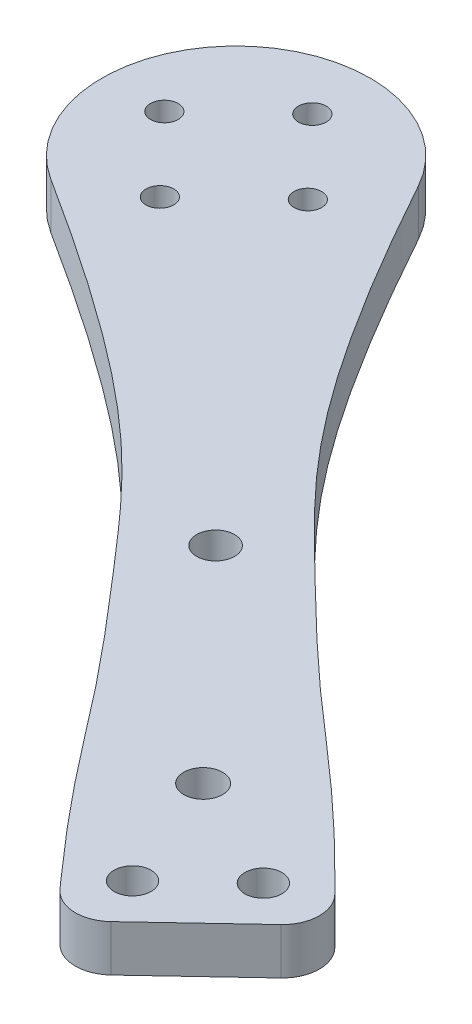
ISO-10303-21;
HEADER;
FILE_DESCRIPTION(('STEP AP214'),'2;1');
FILE_NAME('part.step','',(''),(''),'','','');
FILE_SCHEMA(('AUTOMOTIVE_DESIGN { 1 0 10303 214 1 1 1 1 }'));
ENDSEC;
DATA;
#1=APPLICATION_CONTEXT('core data for automotive mechanical design processes');
#2=APPLICATION_PROTOCOL_DEFINITION('international standard','automotive_design',2000,#1);
#3=PRODUCT_CONTEXT('',#1,'mechanical');
#4=PRODUCT('Part','Part','',(#3));
#5=PRODUCT_RELATED_PRODUCT_CATEGORY('part','',(#4));
#6=PRODUCT_DEFINITION_FORMATION('','',#4);
#7=PRODUCT_DEFINITION_CONTEXT('part definition',#1,'design');
#8=PRODUCT_DEFINITION('design','',#6,#7);
#9=PRODUCT_DEFINITION_SHAPE('','',#8);
#10=(LENGTH_UNIT() NAMED_UNIT(*) SI_UNIT(.MILLI.,.METRE.));
#11=(NAMED_UNIT(*) PLANE_ANGLE_UNIT() SI_UNIT($,.RADIAN.));
#12=(NAMED_UNIT(*) SI_UNIT($,.STERADIAN.) SOLID_ANGLE_UNIT());
#13=UNCERTAINTY_MEASURE_WITH_UNIT(LENGTH_MEASURE(1.E-05),#10,'distance_accuracy_value','');
#14=(GEOMETRIC_REPRESENTATION_CONTEXT(3) GLOBAL_UNCERTAINTY_ASSIGNED_CONTEXT((#13)) GLOBAL_UNIT_ASSIGNED_CONTEXT((#10,
#11,#12)) REPRESENTATION_CONTEXT('',''));
#15=CARTESIAN_POINT('',(0.,0.,0.));
#16=DIRECTION('',(0.,0.,1.));
#17=DIRECTION('',(1.,0.,0.));
#18=AXIS2_PLACEMENT_3D('',#15,#16,#17);
#19=CARTESIAN_POINT('',(-44.0947732228864,5.,-31.5303860412853));
#20=CARTESIAN_POINT('',(-52.4445145966826,5.,-40.8898758768842));
#21=CARTESIAN_POINT('',(-59.2108899865711,5.,-50.6068180202608));
#22=CARTESIAN_POINT('',(-76.0376842546752,5.,-70.1194758281589));
#23=CARTESIAN_POINT('',(-86.2011588527029,5.,-81.5356612766143));
#24=CARTESIAN_POINT('',(-110.568455215221,5.,-96.9836043210985));
#25=B_SPLINE_CURVE_WITH_KNOTS('',3,(#19,#20,#21,#22,#23,#24),.UNSPECIFIED.,.F.,.F.,(4,1,1,4),
(0.,0.287490219149772,0.546399650186931,1.),.UNSPECIFIED.);
#26=DIRECTION('',(0.,-1.,0.));
#27=VECTOR('',#26,1.);
#28=SURFACE_OF_LINEAR_EXTRUSION('',#25,#27);
#29=CARTESIAN_POINT('',(-44.0947732228864,0.,-31.5303860412853));
#30=CARTESIAN_POINT('',(-52.4445145966826,0.,-40.8898758768842));
#31=CARTESIAN_POINT('',(-59.2108899865711,0.,-50.6068180202608));
#32=CARTESIAN_POINT('',(-76.0376842546752,0.,-70.1194758281589));
#33=CARTESIAN_POINT('',(-86.2011588527029,0.,-81.5356612766143));
#34=CARTESIAN_POINT('',(-110.568455215221,0.,-96.9836043210985));
#35=B_SPLINE_CURVE_WITH_KNOTS('',3,(#29,#30,#31,#32,#33,#34),.UNSPECIFIED.,.F.,.F.,(4,1,1,4),
(0.,0.287490219149772,0.546399650186931,1.),.UNSPECIFIED.);
#36=CARTESIAN_POINT('',(-44.0947732228865,0.,-31.5303860412854));
#37=VERTEX_POINT('',#36);
#38=CARTESIAN_POINT('',(-110.568455215221,0.,-96.9836043210992));
#39=VERTEX_POINT('',#38);
#40=EDGE_CURVE('E116',#37,#39,#35,.T.);
#41=ORIENTED_EDGE('',*,*,#40,.F.);
#42=DIRECTION('',(0.,-1.,0.));
#43=VECTOR('',#42,1.);
#44=CARTESIAN_POINT('',(-44.0947732228865,5.,-31.5303860412854));
#45=LINE('',#44,#43);
#46=CARTESIAN_POINT('',(-44.0947732228865,5.,-31.5303860412854));
#47=VERTEX_POINT('',#46);
#48=EDGE_CURVE('E106',#47,#37,#45,.T.);
#49=ORIENTED_EDGE('',*,*,#48,.F.);
#50=CARTESIAN_POINT('',(-110.568455215221,5.,-96.9836043210992));
#51=VERTEX_POINT('',#50);
#52=EDGE_CURVE('E111',#47,#51,#25,.T.);
#53=ORIENTED_EDGE('',*,*,#52,.T.);
#54=DIRECTION('',(0.,-1.,0.));
#55=VECTOR('',#54,1.);
#56=CARTESIAN_POINT('',(-110.568455215221,5.,-96.9836043210992));
#57=LINE('',#56,#55);
#58=EDGE_CURVE('E174',#51,#39,#57,.T.);
#59=ORIENTED_EDGE('',*,*,#58,.T.);
#60=EDGE_LOOP('',(#41,#49,#53,#59));
#61=FACE_BOUND('',#60,.T.);
#62=ADVANCED_FACE('F38',(#61),#28,.T.);
#63=CARTESIAN_POINT('',(-7.64609992327415,5.,7.19632933955224));
#64=DIRECTION('',(-0.728199992692798,0.,0.685364699004996));
#65=DIRECTION('',(0.685364699004996,0.,0.728199992692798));
#66=AXIS2_PLACEMENT_3D('',#63,#64,#65);
#67=PLANE('',#66);
#68=DIRECTION('',(-0.685364699004996,0.,-0.728199992692798));
#69=VECTOR('',#68,1.);
#70=CARTESIAN_POINT('',(-7.64609992327415,0.,7.19632933955224));
#71=LINE('',#70,#69);
#72=CARTESIAN_POINT('',(-43.5319752325021,0.,-30.9324131765019));
#73=VERTEX_POINT('',#72);
#74=EDGE_CURVE('E206',#73,#37,#71,.T.);
#75=ORIENTED_EDGE('',*,*,#74,.F.);
#76=DIRECTION('',(0.,-1.,0.));
#77=VECTOR('',#76,1.);
#78=CARTESIAN_POINT('',(-43.5319752325021,5.,-30.9324131765019));
#79=LINE('',#78,#77);
#80=CARTESIAN_POINT('',(-43.5319752325021,5.,-30.9324131765019));
#81=VERTEX_POINT('',#80);
#82=EDGE_CURVE('E61',#73,#81,#79,.F.);
#83=ORIENTED_EDGE('',*,*,#82,.T.);
#84=DIRECTION('',(-0.685364699004996,0.,-0.728199992692798));
#85=VECTOR('',#84,1.);
#86=CARTESIAN_POINT('',(-7.64609992327415,5.,7.19632933955224));
#87=LINE('',#86,#85);
#88=EDGE_CURVE('E103',#81,#47,#87,.T.);
#89=ORIENTED_EDGE('',*,*,#88,.T.);
#90=ORIENTED_EDGE('',*,*,#48,.T.);
#91=EDGE_LOOP('',(#75,#83,#89,#90));
#92=FACE_BOUND('',#91,.T.);
#93=ADVANCED_FACE('F105',(#92),#67,.T.);
#94=CARTESIAN_POINT('',(-33.1444165132079,5.,-35.2159425452829));
#95=DIRECTION('',(-0.685364699004996,0.,-0.728199992692798));
#96=DIRECTION('',(-0.728199992692798,0.,0.685364699004996));
#97=AXIS2_PLACEMENT_3D('',#94,#95,#96);
#98=PLANE('',#97);
#99=DIRECTION('',(0.728199992692798,0.,-0.685364699004996));
#100=VECTOR('',#99,1.);
#101=CARTESIAN_POINT('',(-33.1444165132079,5.,-35.2159425452829));
#102=LINE('',#101,#100);
#103=CARTESIAN_POINT('',(-37.8777164657109,5.,-30.7610720017507));
#104=VERTEX_POINT('',#103);
#105=CARTESIAN_POINT('',(-28.4111165607045,5.,-39.6708130888157));
#106=VERTEX_POINT('',#105);
#107=EDGE_CURVE('E110',#104,#106,#102,.T.);
#108=ORIENTED_EDGE('',*,*,#107,.F.);
#109=DIRECTION('',(0.,-1.,0.));
#110=VECTOR('',#109,1.);
#111=CARTESIAN_POINT('',(-37.8777164657109,0.,-30.7610720017507));
#112=LINE('',#111,#110);
#113=CARTESIAN_POINT('',(-37.8777164657109,0.,-30.7610720017507));
#114=VERTEX_POINT('',#113);
#115=EDGE_CURVE('E158',#104,#114,#112,.T.);
#116=ORIENTED_EDGE('',*,*,#115,.T.);
#117=DIRECTION('',(0.728199992692798,0.,-0.685364699004996));
#118=VECTOR('',#117,1.);
#119=CARTESIAN_POINT('',(-33.1444165132079,0.,-35.2159425452829));
#120=LINE('',#119,#118);
#121=CARTESIAN_POINT('',(-28.4111165607045,0.,-39.6708130888157));
#122=VERTEX_POINT('',#121);
#123=EDGE_CURVE('E203',#114,#122,#120,.T.);
#124=ORIENTED_EDGE('',*,*,#123,.T.);
#125=DIRECTION('',(0.,-1.,0.));
#126=VECTOR('',#125,1.);
#127=CARTESIAN_POINT('',(-28.4111165607045,5.,-39.6708130888157));
#128=LINE('',#127,#126);
#129=EDGE_CURVE('E117',#122,#106,#128,.F.);
#130=ORIENTED_EDGE('',*,*,#129,.T.);
#131=EDGE_LOOP('',(#108,#116,#124,#130));
#132=FACE_BOUND('',#131,.T.);
#133=ADVANCED_FACE('F253',(#132),#98,.F.);
#134=CARTESIAN_POINT('',(7.64609992327463,5.,-7.19632933955269));
#135=DIRECTION('',(-0.728199992692798,0.,0.685364699004996));
#136=DIRECTION('',(0.685364699004996,0.,0.728199992692798));
#137=AXIS2_PLACEMENT_3D('',#134,#135,#136);
#138=PLANE('',#137);
#139=DIRECTION('',(-0.685364699004996,0.,-0.728199992692798));
#140=VECTOR('',#139,1.);
#141=CARTESIAN_POINT('',(7.64609992327463,5.,-7.19632933955269));
#142=LINE('',#141,#140);
#143=CARTESIAN_POINT('',(-28.2397753859533,5.,-45.3250718556068));
#144=VERTEX_POINT('',#143);
#145=CARTESIAN_POINT('',(-28.8025733763376,5.,-45.9230447203902));
#146=VERTEX_POINT('',#145);
#147=EDGE_CURVE('E238',#144,#146,#142,.T.);
#148=ORIENTED_EDGE('',*,*,#147,.F.);
#149=DIRECTION('',(0.,-1.,0.));
#150=VECTOR('',#149,1.);
#151=CARTESIAN_POINT('',(-28.2397753859533,5.,-45.3250718556068));
#152=LINE('',#151,#150);
#153=CARTESIAN_POINT('',(-28.2397753859533,0.,-45.3250718556068));
#154=VERTEX_POINT('',#153);
#155=EDGE_CURVE('E11',#144,#154,#152,.T.);
#156=ORIENTED_EDGE('',*,*,#155,.T.);
#157=DIRECTION('',(-0.685364699004996,0.,-0.728199992692798));
#158=VECTOR('',#157,1.);
#159=CARTESIAN_POINT('',(7.64609992327463,0.,-7.19632933955269));
#160=LINE('',#159,#158);
#161=CARTESIAN_POINT('',(-28.8025733763376,0.,-45.9230447203902));
#162=VERTEX_POINT('',#161);
#163=EDGE_CURVE('E198',#154,#162,#160,.T.);
#164=ORIENTED_EDGE('',*,*,#163,.T.);
#165=DIRECTION('',(0.,-1.,0.));
#166=VECTOR('',#165,1.);
#167=CARTESIAN_POINT('',(-28.8025733763376,5.,-45.9230447203902));
#168=LINE('',#167,#166);
#169=EDGE_CURVE('E118',#146,#162,#168,.T.);
#170=ORIENTED_EDGE('',*,*,#169,.F.);
#171=EDGE_LOOP('',(#148,#156,#164,#170));
#172=FACE_BOUND('',#171,.T.);
#173=ADVANCED_FACE('F248',(#172),#138,.F.);
#174=CARTESIAN_POINT('',(-28.8025733763376,5.,-45.9230447203903));
#175=CARTESIAN_POINT('',(-37.6393091657515,5.,-54.8241868707019));
#176=CARTESIAN_POINT('',(-46.9287149237894,5.,-62.1665121969967));
#177=CARTESIAN_POINT('',(-65.3866995781917,5.,-80.1439319942612));
#178=CARTESIAN_POINT('',(-76.1665348483291,5.,-90.980013280731));
#179=CARTESIAN_POINT('',(-90.1106820707814,5.,-116.237979045277));
#180=B_SPLINE_CURVE_WITH_KNOTS('',3,(#174,#175,#176,#177,#178,#179),.UNSPECIFIED.,.F.,.F.,(4,1,
1,4),(0.,0.287490219149772,0.546399650186931,1.),.UNSPECIFIED.);
#181=DIRECTION('',(0.,-1.,0.));
#182=VECTOR('',#181,1.);
#183=SURFACE_OF_LINEAR_EXTRUSION('',#180,#182);
#184=CARTESIAN_POINT('',(-28.8025733763376,0.,-45.9230447203903));
#185=CARTESIAN_POINT('',(-37.6393091657515,0.,-54.8241868707019));
#186=CARTESIAN_POINT('',(-46.9287149237894,0.,-62.1665121969967));
#187=CARTESIAN_POINT('',(-65.3866995781917,0.,-80.1439319942612));
#188=CARTESIAN_POINT('',(-76.1665348483291,0.,-90.980013280731));
#189=CARTESIAN_POINT('',(-90.1106820707814,0.,-116.237979045277));
#190=B_SPLINE_CURVE_WITH_KNOTS('',3,(#184,#185,#186,#187,#188,#189),.UNSPECIFIED.,.F.,.F.,(4,1,
1,4),(0.,0.287490219149772,0.546399650186931,1.),.UNSPECIFIED.);
#191=CARTESIAN_POINT('',(-90.1106820707807,0.,-116.237979045278));
#192=VERTEX_POINT('',#191);
#193=EDGE_CURVE('E194',#162,#192,#190,.T.);
#194=ORIENTED_EDGE('',*,*,#193,.T.);
#195=DIRECTION('',(0.,-1.,0.));
#196=VECTOR('',#195,1.);
#197=CARTESIAN_POINT('',(-90.1106820707807,5.,-116.237979045278));
#198=LINE('',#197,#196);
#199=CARTESIAN_POINT('',(-90.1106820707807,5.,-116.237979045278));
#200=VERTEX_POINT('',#199);
#201=EDGE_CURVE('E171',#200,#192,#198,.T.);
#202=ORIENTED_EDGE('',*,*,#201,.F.);
#203=EDGE_CURVE('E233',#146,#200,#180,.T.);
#204=ORIENTED_EDGE('',*,*,#203,.F.);
#205=ORIENTED_EDGE('',*,*,#169,.T.);
#206=EDGE_LOOP('',(#194,#202,#204,#205));
#207=FACE_BOUND('',#206,.T.);
#208=ADVANCED_FACE('F243',(#207),#183,.F.);
#209=CARTESIAN_POINT('',(-94.8083754175846,5.,-108.987685890797));
#210=DIRECTION('',(0.,-1.,0.));
#211=DIRECTION('',(0.,0.,-1.));
#212=AXIS2_PLACEMENT_3D('',#209,#210,#211);
#213=CYLINDRICAL_SURFACE('',#212,1.5);
#214=CARTESIAN_POINT('',(-94.8083754175846,5.,-108.987685890797));
#215=DIRECTION('',(0.,1.,0.));
#216=DIRECTION('',(0.,0.,1.));
#217=AXIS2_PLACEMENT_3D('',#214,#215,#216);
#218=CIRCLE('',#217,1.5);
#219=CARTESIAN_POINT('',(-94.8083754175846,5.,-107.487685890797));
#220=VERTEX_POINT('',#219);
#221=EDGE_CURVE('E217',#220,#220,#218,.T.);
#222=ORIENTED_EDGE('',*,*,#221,.T.);
#223=EDGE_LOOP('',(#222));
#224=FACE_BOUND('',#223,.T.);
#225=CARTESIAN_POINT('',(-94.8083754175846,0.,-108.987685890797));
#226=DIRECTION('',(0.,1.,0.));
#227=DIRECTION('',(0.,0.,1.));
#228=AXIS2_PLACEMENT_3D('',#225,#226,#227);
#229=CIRCLE('',#228,1.5);
#230=CARTESIAN_POINT('',(-94.8083754175846,0.,-107.487685890797));
#231=VERTEX_POINT('',#230);
#232=EDGE_CURVE('E128',#231,#231,#229,.T.);
#233=ORIENTED_EDGE('',*,*,#232,.F.);
#234=EDGE_LOOP('',(#233));
#235=FACE_BOUND('',#234,.T.);
#236=ADVANCED_FACE('F247',(#224,#235),#213,.F.);
#237=CARTESIAN_POINT('',(-40.5139911861372,5.,-35.7507296790653));
#238=DIRECTION('',(0.,-1.,0.));
#239=DIRECTION('',(0.,0.,-1.));
#240=AXIS2_PLACEMENT_3D('',#237,#238,#239);
#241=CYLINDRICAL_SURFACE('',#240,2.);
#242=CARTESIAN_POINT('',(-40.5139911861372,5.,-35.7507296790653));
#243=DIRECTION('',(0.,1.,0.));
#244=DIRECTION('',(0.,0.,1.));
#245=AXIS2_PLACEMENT_3D('',#242,#243,#244);
#246=CIRCLE('',#245,2.);
#247=CARTESIAN_POINT('',(-40.5139911861372,5.,-33.7507296790653));
#248=VERTEX_POINT('',#247);
#249=EDGE_CURVE('E220',#248,#248,#246,.T.);
#250=ORIENTED_EDGE('',*,*,#249,.T.);
#251=EDGE_LOOP('',(#250));
#252=FACE_BOUND('',#251,.T.);
#253=CARTESIAN_POINT('',(-40.5139911861372,0.,-35.7507296790653));
#254=DIRECTION('',(0.,1.,0.));
#255=DIRECTION('',(0.,0.,1.));
#256=AXIS2_PLACEMENT_3D('',#253,#254,#255);
#257=CIRCLE('',#256,2.);
#258=CARTESIAN_POINT('',(-40.5139911861372,0.,-33.7507296790653));
#259=VERTEX_POINT('',#258);
#260=EDGE_CURVE('E179',#259,#259,#257,.T.);
#261=ORIENTED_EDGE('',*,*,#260,.F.);
#262=EDGE_LOOP('',(#261));
#263=FACE_BOUND('',#262,.T.);
#264=ADVANCED_FACE('F299',(#252,#263),#241,.F.);
#265=CARTESIAN_POINT('',(-33.2319912592091,5.,-42.6043766691152));
#266=DIRECTION('',(0.,-1.,0.));
#267=DIRECTION('',(0.,0.,-1.));
#268=AXIS2_PLACEMENT_3D('',#265,#266,#267);
#269=CYLINDRICAL_SURFACE('',#268,2.);
#270=CARTESIAN_POINT('',(-33.2319912592091,5.,-42.6043766691152));
#271=DIRECTION('',(0.,1.,0.));
#272=DIRECTION('',(0.,0.,1.));
#273=AXIS2_PLACEMENT_3D('',#270,#271,#272);
#274=CIRCLE('',#273,2.);
#275=CARTESIAN_POINT('',(-33.2319912592091,5.,-40.6043766691152));
#276=VERTEX_POINT('',#275);
#277=EDGE_CURVE('E223',#276,#276,#274,.T.);
#278=ORIENTED_EDGE('',*,*,#277,.T.);
#279=EDGE_LOOP('',(#278));
#280=FACE_BOUND('',#279,.T.);
#281=CARTESIAN_POINT('',(-33.2319912592091,0.,-42.6043766691152));
#282=DIRECTION('',(0.,1.,0.));
#283=DIRECTION('',(0.,0.,1.));
#284=AXIS2_PLACEMENT_3D('',#281,#282,#283);
#285=CIRCLE('',#284,2.);
#286=CARTESIAN_POINT('',(-33.2319912592091,0.,-40.6043766691152));
#287=VERTEX_POINT('',#286);
#288=EDGE_CURVE('E182',#287,#287,#285,.T.);
#289=ORIENTED_EDGE('',*,*,#288,.F.);
#290=EDGE_LOOP('',(#289));
#291=FACE_BOUND('',#290,.T.);
#292=ADVANCED_FACE('F303',(#280,#291),#269,.F.);
#293=CARTESIAN_POINT('',(-110.801034283912,5.,-109.472311917046));
#294=DIRECTION('',(0.,-1.,0.));
#295=DIRECTION('',(0.,0.,-1.));
#296=AXIS2_PLACEMENT_3D('',#293,#294,#295);
#297=CYLINDRICAL_SURFACE('',#296,1.5);
#298=CARTESIAN_POINT('',(-110.801034283912,5.,-109.472311917046));
#299=DIRECTION('',(0.,1.,0.));
#300=DIRECTION('',(0.,0.,1.));
#301=AXIS2_PLACEMENT_3D('',#298,#299,#300);
#302=CIRCLE('',#301,1.5);
#303=CARTESIAN_POINT('',(-110.801034283912,5.,-107.972311917046));
#304=VERTEX_POINT('',#303);
#305=EDGE_CURVE('E226',#304,#304,#302,.T.);
#306=ORIENTED_EDGE('',*,*,#305,.T.);
#307=EDGE_LOOP('',(#306));
#308=FACE_BOUND('',#307,.T.);
#309=CARTESIAN_POINT('',(-110.801034283912,0.,-109.472311917046));
#310=DIRECTION('',(0.,1.,0.));
#311=DIRECTION('',(0.,0.,1.));
#312=AXIS2_PLACEMENT_3D('',#309,#310,#311);
#313=CIRCLE('',#312,1.5);
#314=CARTESIAN_POINT('',(-110.801034283912,0.,-107.972311917046));
#315=VERTEX_POINT('',#314);
#316=EDGE_CURVE('E185',#315,#315,#313,.T.);
#317=ORIENTED_EDGE('',*,*,#316,.F.);
#318=EDGE_LOOP('',(#317));
#319=FACE_BOUND('',#318,.T.);
#320=ADVANCED_FACE('F307',(#308,#319),#297,.F.);
#321=CARTESIAN_POINT('',(-103.047017863875,5.,-101.233669470757));
#322=DIRECTION('',(0.,-1.,0.));
#323=DIRECTION('',(0.,0.,-1.));
#324=AXIS2_PLACEMENT_3D('',#321,#322,#323);
#325=CYLINDRICAL_SURFACE('',#324,1.5);
#326=CARTESIAN_POINT('',(-103.047017863875,5.,-101.233669470757));
#327=DIRECTION('',(0.,1.,0.));
#328=DIRECTION('',(0.,0.,1.));
#329=AXIS2_PLACEMENT_3D('',#326,#327,#328);
#330=CIRCLE('',#329,1.5);
#331=CARTESIAN_POINT('',(-103.047017863875,5.,-99.7336694707569));
#332=VERTEX_POINT('',#331);
#333=EDGE_CURVE('E229',#332,#332,#330,.F.);
#334=ORIENTED_EDGE('',*,*,#333,.F.);
#335=EDGE_LOOP('',(#334));
#336=FACE_BOUND('',#335,.T.);
#337=CARTESIAN_POINT('',(-103.047017863875,0.,-101.233669470757));
#338=DIRECTION('',(0.,1.,0.));
#339=DIRECTION('',(0.,0.,1.));
#340=AXIS2_PLACEMENT_3D('',#337,#338,#339);
#341=CIRCLE('',#340,1.5);
#342=CARTESIAN_POINT('',(-103.047017863875,0.,-99.7336694707569));
#343=VERTEX_POINT('',#342);
#344=EDGE_CURVE('E188',#343,#343,#341,.F.);
#345=ORIENTED_EDGE('',*,*,#344,.T.);
#346=EDGE_LOOP('',(#345));
#347=FACE_BOUND('',#346,.T.);
#348=ADVANCED_FACE('F294',(#336,#347),#325,.F.);
#349=CARTESIAN_POINT('',(-102.804704850748,5.,-109.229998903921));
#350=DIRECTION('',(0.,-1.,0.));
#351=DIRECTION('',(0.,0.,-1.));
#352=AXIS2_PLACEMENT_3D('',#349,#350,#351);
#353=CYLINDRICAL_SURFACE('',#352,14.5);
#354=CARTESIAN_POINT('',(-102.804704850748,0.,-109.229998903921));
#355=DIRECTION('',(0.,1.,0.));
#356=DIRECTION('',(0.,0.,1.));
#357=AXIS2_PLACEMENT_3D('',#354,#355,#356);
#358=CIRCLE('',#357,14.5);
#359=EDGE_CURVE('E191',#192,#39,#358,.T.);
#360=ORIENTED_EDGE('',*,*,#359,.T.);
#361=ORIENTED_EDGE('',*,*,#58,.F.);
#362=CARTESIAN_POINT('',(-102.804704850748,5.,-109.229998903921));
#363=DIRECTION('',(0.,1.,0.));
#364=DIRECTION('',(0.,0.,1.));
#365=AXIS2_PLACEMENT_3D('',#362,#363,#364);
#366=CIRCLE('',#365,14.5);
#367=EDGE_CURVE('E123',#200,#51,#366,.T.);
#368=ORIENTED_EDGE('',*,*,#367,.F.);
#369=ORIENTED_EDGE('',*,*,#201,.T.);
#370=EDGE_LOOP('',(#360,#361,#368,#369));
#371=FACE_BOUND('',#370,.T.);
#372=ADVANCED_FACE('F250',(#371),#353,.T.);
#373=CARTESIAN_POINT('',(-102.562391837623,5.,-117.226328337084));
#374=DIRECTION('',(0.,-1.,0.));
#375=DIRECTION('',(0.,0.,-1.));
#376=AXIS2_PLACEMENT_3D('',#373,#374,#375);
#377=CYLINDRICAL_SURFACE('',#376,1.5);
#378=CARTESIAN_POINT('',(-102.562391837623,5.,-117.226328337084));
#379=DIRECTION('',(0.,1.,0.));
#380=DIRECTION('',(0.,0.,1.));
#381=AXIS2_PLACEMENT_3D('',#378,#379,#380);
#382=CIRCLE('',#381,1.5);
#383=CARTESIAN_POINT('',(-102.562391837623,5.,-115.726328337084));
#384=VERTEX_POINT('',#383);
#385=EDGE_CURVE('E175',#384,#384,#382,.F.);
#386=ORIENTED_EDGE('',*,*,#385,.F.);
#387=EDGE_LOOP('',(#386));
#388=FACE_BOUND('',#387,.T.);
#389=CARTESIAN_POINT('',(-102.562391837623,0.,-117.226328337084));
#390=DIRECTION('',(0.,1.,0.));
#391=DIRECTION('',(0.,0.,1.));
#392=AXIS2_PLACEMENT_3D('',#389,#390,#391);
#393=CIRCLE('',#392,1.5);
#394=CARTESIAN_POINT('',(-102.562391837623,0.,-115.726328337084));
#395=VERTEX_POINT('',#394);
#396=EDGE_CURVE('E125',#395,#395,#393,.F.);
#397=ORIENTED_EDGE('',*,*,#396,.T.);
#398=EDGE_LOOP('',(#397));
#399=FACE_BOUND('',#398,.T.);
#400=ADVANCED_FACE('F284',(#388,#399),#377,.F.);
#401=CARTESIAN_POINT('',(0.,5.,0.));
#402=DIRECTION('',(0.,1.,0.));
#403=DIRECTION('',(0.,0.,1.));
#404=AXIS2_PLACEMENT_3D('',#401,#402,#403);
#405=PLANE('',#404);
#406=CARTESIAN_POINT('',(-67.4126514634747,5.,-71.6259421799069));
#407=DIRECTION('',(0.,1.,0.));
#408=DIRECTION('',(0.,0.,1.));
#409=AXIS2_PLACEMENT_3D('',#406,#407,#408);
#410=CIRCLE('',#409,2.04999999999999);
#411=CARTESIAN_POINT('',(-67.4126514634747,5.,-69.5759421799069));
#412=VERTEX_POINT('',#411);
#413=EDGE_CURVE('E400',#412,#412,#410,.F.);
#414=ORIENTED_EDGE('',*,*,#413,.T.);
#415=EDGE_LOOP('',(#414));
#416=FACE_BOUND('',#415,.T.);
#417=CARTESIAN_POINT('',(-45.8184922393139,5.,-48.6821480042415));
#418=DIRECTION('',(0.,1.,0.));
#419=DIRECTION('',(0.,0.,1.));
#420=AXIS2_PLACEMENT_3D('',#417,#418,#419);
#421=CIRCLE('',#420,2.10000000000014);
#422=CARTESIAN_POINT('',(-45.8184922393139,5.,-46.5821480042413));
#423=VERTEX_POINT('',#422);
#424=EDGE_CURVE('E134',#423,#423,#421,.T.);
#425=ORIENTED_EDGE('',*,*,#424,.F.);
#426=EDGE_LOOP('',(#425));
#427=FACE_BOUND('',#426,.T.);
#428=ORIENTED_EDGE('',*,*,#88,.F.);
#429=CARTESIAN_POINT('',(-40.6191752617309,5.,-33.6738719725219));
#430=DIRECTION('',(0.,1.,0.));
#431=DIRECTION('',(0.,0.,1.));
#432=AXIS2_PLACEMENT_3D('',#429,#430,#431);
#433=CIRCLE('',#432,4.);
#434=EDGE_CURVE('E46',#81,#104,#433,.T.);
#435=ORIENTED_EDGE('',*,*,#434,.T.);
#436=ORIENTED_EDGE('',*,*,#107,.T.);
#437=CARTESIAN_POINT('',(-31.1525753567245,5.,-42.5836130595868));
#438=DIRECTION('',(0.,1.,0.));
#439=DIRECTION('',(0.,0.,1.));
#440=AXIS2_PLACEMENT_3D('',#437,#438,#439);
#441=CIRCLE('',#440,4.);
#442=EDGE_CURVE('E53',#106,#144,#441,.T.);
#443=ORIENTED_EDGE('',*,*,#442,.T.);
#444=ORIENTED_EDGE('',*,*,#147,.T.);
#445=ORIENTED_EDGE('',*,*,#203,.T.);
#446=ORIENTED_EDGE('',*,*,#367,.T.);
#447=ORIENTED_EDGE('',*,*,#52,.F.);
#448=EDGE_LOOP('',(#428,#435,#436,#443,#444,#445,#446,#447));
#449=FACE_BOUND('',#448,.T.);
#450=ORIENTED_EDGE('',*,*,#333,.T.);
#451=EDGE_LOOP('',(#450));
#452=FACE_BOUND('',#451,.T.);
#453=ORIENTED_EDGE('',*,*,#305,.F.);
#454=EDGE_LOOP('',(#453));
#455=FACE_BOUND('',#454,.T.);
#456=ORIENTED_EDGE('',*,*,#277,.F.);
#457=EDGE_LOOP('',(#456));
#458=FACE_BOUND('',#457,.T.);
#459=ORIENTED_EDGE('',*,*,#249,.F.);
#460=EDGE_LOOP('',(#459));
#461=FACE_BOUND('',#460,.T.);
#462=ORIENTED_EDGE('',*,*,#221,.F.);
#463=EDGE_LOOP('',(#462));
#464=FACE_BOUND('',#463,.T.);
#465=ORIENTED_EDGE('',*,*,#385,.T.);
#466=EDGE_LOOP('',(#465));
#467=FACE_BOUND('',#466,.T.);
#468=ADVANCED_FACE('F120',(#416,#427,#449,#452,#455,#458,#461,#464,#467),#405,.T.);
#469=CARTESIAN_POINT('',(0.,0.,0.));
#470=DIRECTION('',(0.,1.,0.));
#471=DIRECTION('',(0.,0.,1.));
#472=AXIS2_PLACEMENT_3D('',#469,#470,#471);
#473=PLANE('',#472);
#474=CARTESIAN_POINT('',(-67.4126514634747,0.,-71.6259421799069));
#475=DIRECTION('',(0.,-1.,0.));
#476=DIRECTION('',(0.,0.,-1.));
#477=AXIS2_PLACEMENT_3D('',#474,#475,#476);
#478=CIRCLE('',#477,2.04999999999999);
#479=CARTESIAN_POINT('',(-67.4126514634747,0.,-73.6759421799068));
#480=VERTEX_POINT('',#479);
#481=EDGE_CURVE('E403',#480,#480,#478,.T.);
#482=ORIENTED_EDGE('',*,*,#481,.F.);
#483=EDGE_LOOP('',(#482));
#484=FACE_BOUND('',#483,.T.);
#485=CARTESIAN_POINT('',(-45.8184922393139,0.,-48.6821480042415));
#486=DIRECTION('',(0.,1.,0.));
#487=DIRECTION('',(0.,0.,1.));
#488=AXIS2_PLACEMENT_3D('',#485,#486,#487);
#489=CIRCLE('',#488,2.10000000000014);
#490=CARTESIAN_POINT('',(-45.8184922393139,0.,-46.5821480042413));
#491=VERTEX_POINT('',#490);
#492=EDGE_CURVE('E211',#491,#491,#489,.T.);
#493=ORIENTED_EDGE('',*,*,#492,.T.);
#494=EDGE_LOOP('',(#493));
#495=FACE_BOUND('',#494,.T.);
#496=ORIENTED_EDGE('',*,*,#123,.F.);
#497=CARTESIAN_POINT('',(-40.6191752617309,0.,-33.6738719725219));
#498=DIRECTION('',(0.,1.,0.));
#499=DIRECTION('',(0.,0.,1.));
#500=AXIS2_PLACEMENT_3D('',#497,#498,#499);
#501=CIRCLE('',#500,4.);
#502=EDGE_CURVE('E163',#114,#73,#501,.F.);
#503=ORIENTED_EDGE('',*,*,#502,.T.);
#504=ORIENTED_EDGE('',*,*,#74,.T.);
#505=ORIENTED_EDGE('',*,*,#40,.T.);
#506=ORIENTED_EDGE('',*,*,#359,.F.);
#507=ORIENTED_EDGE('',*,*,#193,.F.);
#508=ORIENTED_EDGE('',*,*,#163,.F.);
#509=CARTESIAN_POINT('',(-31.1525753567245,0.,-42.5836130595868));
#510=DIRECTION('',(0.,1.,0.));
#511=DIRECTION('',(0.,0.,1.));
#512=AXIS2_PLACEMENT_3D('',#509,#510,#511);
#513=CIRCLE('',#512,4.);
#514=EDGE_CURVE('E165',#154,#122,#513,.F.);
#515=ORIENTED_EDGE('',*,*,#514,.T.);
#516=EDGE_LOOP('',(#496,#503,#504,#505,#506,#507,#508,#515));
#517=FACE_BOUND('',#516,.T.);
#518=ORIENTED_EDGE('',*,*,#344,.F.);
#519=EDGE_LOOP('',(#518));
#520=FACE_BOUND('',#519,.T.);
#521=ORIENTED_EDGE('',*,*,#316,.T.);
#522=EDGE_LOOP('',(#521));
#523=FACE_BOUND('',#522,.T.);
#524=ORIENTED_EDGE('',*,*,#288,.T.);
#525=EDGE_LOOP('',(#524));
#526=FACE_BOUND('',#525,.T.);
#527=ORIENTED_EDGE('',*,*,#260,.T.);
#528=EDGE_LOOP('',(#527));
#529=FACE_BOUND('',#528,.T.);
#530=ORIENTED_EDGE('',*,*,#232,.T.);
#531=EDGE_LOOP('',(#530));
#532=FACE_BOUND('',#531,.T.);
#533=ORIENTED_EDGE('',*,*,#396,.F.);
#534=EDGE_LOOP('',(#533));
#535=FACE_BOUND('',#534,.T.);
#536=ADVANCED_FACE('F146',(#484,#495,#517,#520,#523,#526,#529,#532,#535),#473,.F.);
#537=CARTESIAN_POINT('',(-40.6191752617309,5.,-33.6738719725219));
#538=DIRECTION('',(0.,1.,0.));
#539=DIRECTION('',(0.,0.,1.));
#540=AXIS2_PLACEMENT_3D('',#537,#538,#539);
#541=CYLINDRICAL_SURFACE('',#540,4.);
#542=ORIENTED_EDGE('',*,*,#434,.F.);
#543=ORIENTED_EDGE('',*,*,#82,.F.);
#544=ORIENTED_EDGE('',*,*,#502,.F.);
#545=ORIENTED_EDGE('',*,*,#115,.F.);
#546=EDGE_LOOP('',(#542,#543,#544,#545));
#547=FACE_BOUND('',#546,.T.);
#548=ADVANCED_FACE('F144',(#547),#541,.T.);
#549=CARTESIAN_POINT('',(-31.1525753567245,5.,-42.5836130595868));
#550=DIRECTION('',(0.,-1.,0.));
#551=DIRECTION('',(0.,0.,-1.));
#552=AXIS2_PLACEMENT_3D('',#549,#550,#551);
#553=CYLINDRICAL_SURFACE('',#552,4.);
#554=ORIENTED_EDGE('',*,*,#442,.F.);
#555=ORIENTED_EDGE('',*,*,#129,.F.);
#556=ORIENTED_EDGE('',*,*,#514,.F.);
#557=ORIENTED_EDGE('',*,*,#155,.F.);
#558=EDGE_LOOP('',(#554,#555,#556,#557));
#559=FACE_BOUND('',#558,.T.);
#560=ADVANCED_FACE('F40',(#559),#553,.T.);
#561=CARTESIAN_POINT('',(-45.8184922393139,0.,-48.6821480042415));
#562=DIRECTION('',(0.,1.,0.));
#563=DIRECTION('',(0.,0.,1.));
#564=AXIS2_PLACEMENT_3D('',#561,#562,#563);
#565=CYLINDRICAL_SURFACE('',#564,2.10000000000014);
#566=ORIENTED_EDGE('',*,*,#492,.F.);
#567=EDGE_LOOP('',(#566));
#568=FACE_BOUND('',#567,.T.);
#569=ORIENTED_EDGE('',*,*,#424,.T.);
#570=EDGE_LOOP('',(#569));
#571=FACE_BOUND('',#570,.T.);
#572=ADVANCED_FACE('F152',(#568,#571),#565,.F.);
#573=CARTESIAN_POINT('',(-67.4126514634747,5.001,-71.6259421799069));
#574=DIRECTION('',(0.,-1.,0.));
#575=DIRECTION('',(0.,0.,-1.));
#576=AXIS2_PLACEMENT_3D('',#573,#574,#575);
#577=CYLINDRICAL_SURFACE('',#576,2.04999999999999);
#578=ORIENTED_EDGE('',*,*,#413,.F.);
#579=EDGE_LOOP('',(#578));
#580=FACE_BOUND('',#579,.T.);
#581=ORIENTED_EDGE('',*,*,#481,.T.);
#582=EDGE_LOOP('',(#581));
#583=FACE_BOUND('',#582,.T.);
#584=ADVANCED_FACE('F381',(#580,#583),#577,.F.);
#585=CLOSED_SHELL('',(#62,#93,#133,#173,#208,#236,#264,#292,#320,#348,#372,#400,#468,#536,#548,
#560,#572,#584));
#586=MANIFOLD_SOLID_BREP('B2',#585);
#587=ADVANCED_BREP_SHAPE_REPRESENTATION('',(#18,#586),#14);
#588=SHAPE_DEFINITION_REPRESENTATION(#9,#587);
ENDSEC;
END-ISO-10303-21;
